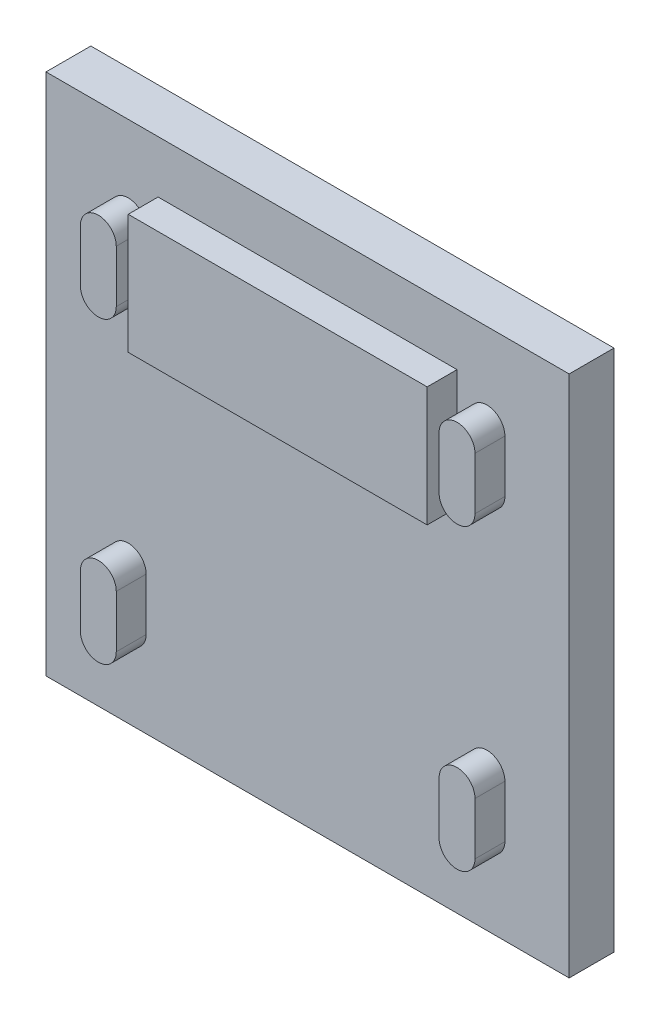
ISO-10303-21;
HEADER;
FILE_DESCRIPTION(('STEP AP214'),'2;1');
FILE_NAME('part.step','',(''),(''),'','','');
FILE_SCHEMA(('AUTOMOTIVE_DESIGN { 1 0 10303 214 1 1 1 1 }'));
ENDSEC;
DATA;
#1=APPLICATION_CONTEXT('core data for automotive mechanical design processes');
#2=APPLICATION_PROTOCOL_DEFINITION('international standard','automotive_design',2000,#1);
#3=PRODUCT_CONTEXT('',#1,'mechanical');
#4=PRODUCT('Part','Part','',(#3));
#5=PRODUCT_RELATED_PRODUCT_CATEGORY('part','',(#4));
#6=PRODUCT_DEFINITION_FORMATION('','',#4);
#7=PRODUCT_DEFINITION_CONTEXT('part definition',#1,'design');
#8=PRODUCT_DEFINITION('design','',#6,#7);
#9=PRODUCT_DEFINITION_SHAPE('','',#8);
#10=(LENGTH_UNIT() NAMED_UNIT(*) SI_UNIT(.MILLI.,.METRE.));
#11=(NAMED_UNIT(*) PLANE_ANGLE_UNIT() SI_UNIT($,.RADIAN.));
#12=(NAMED_UNIT(*) SI_UNIT($,.STERADIAN.) SOLID_ANGLE_UNIT());
#13=UNCERTAINTY_MEASURE_WITH_UNIT(LENGTH_MEASURE(1.E-05),#10,'distance_accuracy_value','');
#14=(GEOMETRIC_REPRESENTATION_CONTEXT(3) GLOBAL_UNCERTAINTY_ASSIGNED_CONTEXT((#13)) GLOBAL_UNIT_ASSIGNED_CONTEXT((#10,
#11,#12)) REPRESENTATION_CONTEXT('',''));
#15=CARTESIAN_POINT('',(0.,0.,0.));
#16=DIRECTION('',(0.,0.,1.));
#17=DIRECTION('',(1.,0.,0.));
#18=AXIS2_PLACEMENT_3D('',#15,#16,#17);
#19=CARTESIAN_POINT('',(0.,0.,3.));
#20=DIRECTION('',(0.,0.,1.));
#21=DIRECTION('',(1.,0.,0.));
#22=AXIS2_PLACEMENT_3D('',#19,#20,#21);
#23=PLANE('',#22);
#24=DIRECTION('',(0.,-1.,0.));
#25=VECTOR('',#24,1.);
#26=CARTESIAN_POINT('',(-17.5,-17.5,3.));
#27=LINE('',#26,#25);
#28=CARTESIAN_POINT('',(-17.5,17.5,3.));
#29=VERTEX_POINT('',#28);
#30=CARTESIAN_POINT('',(-17.5,-17.5,3.));
#31=VERTEX_POINT('',#30);
#32=EDGE_CURVE('E358',#29,#31,#27,.T.);
#33=ORIENTED_EDGE('',*,*,#32,.T.);
#34=DIRECTION('',(1.,0.,0.));
#35=VECTOR('',#34,1.);
#36=CARTESIAN_POINT('',(17.5,-17.5,3.));
#37=LINE('',#36,#35);
#38=CARTESIAN_POINT('',(17.5,-17.5,3.));
#39=VERTEX_POINT('',#38);
#40=EDGE_CURVE('E361',#31,#39,#37,.T.);
#41=ORIENTED_EDGE('',*,*,#40,.T.);
#42=DIRECTION('',(0.,1.,0.));
#43=VECTOR('',#42,1.);
#44=CARTESIAN_POINT('',(17.5,-17.5,3.));
#45=LINE('',#44,#43);
#46=CARTESIAN_POINT('',(17.5,17.5,3.));
#47=VERTEX_POINT('',#46);
#48=EDGE_CURVE('E364',#39,#47,#45,.T.);
#49=ORIENTED_EDGE('',*,*,#48,.T.);
#50=DIRECTION('',(-1.,0.,0.));
#51=VECTOR('',#50,1.);
#52=CARTESIAN_POINT('',(17.5,17.5,3.));
#53=LINE('',#52,#51);
#54=EDGE_CURVE('E366',#47,#29,#53,.T.);
#55=ORIENTED_EDGE('',*,*,#54,.T.);
#56=EDGE_LOOP('',(#33,#41,#49,#55));
#57=FACE_BOUND('',#56,.T.);
#58=DIRECTION('',(0.,1.,0.));
#59=VECTOR('',#58,1.);
#60=CARTESIAN_POINT('',(-10.8,8.25,3.));
#61=LINE('',#60,#59);
#62=CARTESIAN_POINT('',(-10.8,8.25,3.));
#63=VERTEX_POINT('',#62);
#64=CARTESIAN_POINT('',(-10.8,11.75,3.));
#65=VERTEX_POINT('',#64);
#66=EDGE_CURVE('E237',#63,#65,#61,.T.);
#67=ORIENTED_EDGE('',*,*,#66,.F.);
#68=CARTESIAN_POINT('',(-12.,8.25,3.));
#69=DIRECTION('',(0.,0.,1.));
#70=DIRECTION('',(1.,0.,0.));
#71=AXIS2_PLACEMENT_3D('',#68,#69,#70);
#72=CIRCLE('',#71,1.2);
#73=CARTESIAN_POINT('',(-13.2,8.25,3.));
#74=VERTEX_POINT('',#73);
#75=EDGE_CURVE('E234',#74,#63,#72,.T.);
#76=ORIENTED_EDGE('',*,*,#75,.F.);
#77=DIRECTION('',(0.,-1.,0.));
#78=VECTOR('',#77,1.);
#79=CARTESIAN_POINT('',(-13.2,8.25,3.));
#80=LINE('',#79,#78);
#81=CARTESIAN_POINT('',(-13.2,11.75,3.));
#82=VERTEX_POINT('',#81);
#83=EDGE_CURVE('E336',#82,#74,#80,.T.);
#84=ORIENTED_EDGE('',*,*,#83,.F.);
#85=CARTESIAN_POINT('',(-12.,11.75,3.));
#86=DIRECTION('',(0.,0.,1.));
#87=DIRECTION('',(1.,0.,0.));
#88=AXIS2_PLACEMENT_3D('',#85,#86,#87);
#89=CIRCLE('',#88,1.2);
#90=EDGE_CURVE('E344',#65,#82,#89,.T.);
#91=ORIENTED_EDGE('',*,*,#90,.F.);
#92=EDGE_LOOP('',(#67,#76,#84,#91));
#93=FACE_BOUND('',#92,.T.);
#94=DIRECTION('',(0.,1.,0.));
#95=VECTOR('',#94,1.);
#96=CARTESIAN_POINT('',(-10.8,-11.75,3.));
#97=LINE('',#96,#95);
#98=CARTESIAN_POINT('',(-10.8,-11.75,3.));
#99=VERTEX_POINT('',#98);
#100=CARTESIAN_POINT('',(-10.8,-8.25,3.));
#101=VERTEX_POINT('',#100);
#102=EDGE_CURVE('E233',#99,#101,#97,.T.);
#103=ORIENTED_EDGE('',*,*,#102,.F.);
#104=CARTESIAN_POINT('',(-12.,-11.75,3.));
#105=DIRECTION('',(0.,0.,1.));
#106=DIRECTION('',(1.,0.,0.));
#107=AXIS2_PLACEMENT_3D('',#104,#105,#106);
#108=CIRCLE('',#107,1.2);
#109=CARTESIAN_POINT('',(-13.2,-11.75,3.));
#110=VERTEX_POINT('',#109);
#111=EDGE_CURVE('E227',#110,#99,#108,.T.);
#112=ORIENTED_EDGE('',*,*,#111,.F.);
#113=DIRECTION('',(0.,-1.,0.));
#114=VECTOR('',#113,1.);
#115=CARTESIAN_POINT('',(-13.2,-11.75,3.));
#116=LINE('',#115,#114);
#117=CARTESIAN_POINT('',(-13.2,-8.25,3.));
#118=VERTEX_POINT('',#117);
#119=EDGE_CURVE('E208',#118,#110,#116,.T.);
#120=ORIENTED_EDGE('',*,*,#119,.F.);
#121=CARTESIAN_POINT('',(-12.,-8.25,3.));
#122=DIRECTION('',(0.,0.,1.));
#123=DIRECTION('',(1.,0.,0.));
#124=AXIS2_PLACEMENT_3D('',#121,#122,#123);
#125=CIRCLE('',#124,1.2);
#126=EDGE_CURVE('E220',#101,#118,#125,.T.);
#127=ORIENTED_EDGE('',*,*,#126,.F.);
#128=EDGE_LOOP('',(#103,#112,#120,#127));
#129=FACE_BOUND('',#128,.T.);
#130=DIRECTION('',(0.,1.,0.));
#131=VECTOR('',#130,1.);
#132=CARTESIAN_POINT('',(13.2,-11.75,3.));
#133=LINE('',#132,#131);
#134=CARTESIAN_POINT('',(13.2,-11.75,3.));
#135=VERTEX_POINT('',#134);
#136=CARTESIAN_POINT('',(13.2,-8.25,3.));
#137=VERTEX_POINT('',#136);
#138=EDGE_CURVE('E266',#135,#137,#133,.T.);
#139=ORIENTED_EDGE('',*,*,#138,.F.);
#140=CARTESIAN_POINT('',(12.,-11.75,3.));
#141=DIRECTION('',(0.,0.,1.));
#142=DIRECTION('',(1.,0.,0.));
#143=AXIS2_PLACEMENT_3D('',#140,#141,#142);
#144=CIRCLE('',#143,1.2);
#145=CARTESIAN_POINT('',(10.8,-11.75,3.));
#146=VERTEX_POINT('',#145);
#147=EDGE_CURVE('E268',#146,#135,#144,.T.);
#148=ORIENTED_EDGE('',*,*,#147,.F.);
#149=DIRECTION('',(0.,-1.,0.));
#150=VECTOR('',#149,1.);
#151=CARTESIAN_POINT('',(10.8,-11.75,3.));
#152=LINE('',#151,#150);
#153=CARTESIAN_POINT('',(10.8,-8.25,3.));
#154=VERTEX_POINT('',#153);
#155=EDGE_CURVE('E260',#154,#146,#152,.T.);
#156=ORIENTED_EDGE('',*,*,#155,.F.);
#157=CARTESIAN_POINT('',(12.,-8.25,3.));
#158=DIRECTION('',(0.,0.,1.));
#159=DIRECTION('',(1.,0.,0.));
#160=AXIS2_PLACEMENT_3D('',#157,#158,#159);
#161=CIRCLE('',#160,1.2);
#162=EDGE_CURVE('E262',#137,#154,#161,.T.);
#163=ORIENTED_EDGE('',*,*,#162,.F.);
#164=EDGE_LOOP('',(#139,#148,#156,#163));
#165=FACE_BOUND('',#164,.T.);
#166=DIRECTION('',(0.,1.,0.));
#167=VECTOR('',#166,1.);
#168=CARTESIAN_POINT('',(13.2,8.25,3.));
#169=LINE('',#168,#167);
#170=CARTESIAN_POINT('',(13.2,8.25,3.));
#171=VERTEX_POINT('',#170);
#172=CARTESIAN_POINT('',(13.2,11.75,3.));
#173=VERTEX_POINT('',#172);
#174=EDGE_CURVE('E295',#171,#173,#169,.T.);
#175=ORIENTED_EDGE('',*,*,#174,.F.);
#176=CARTESIAN_POINT('',(12.,8.25,3.));
#177=DIRECTION('',(0.,0.,1.));
#178=DIRECTION('',(1.,0.,0.));
#179=AXIS2_PLACEMENT_3D('',#176,#177,#178);
#180=CIRCLE('',#179,1.2);
#181=CARTESIAN_POINT('',(10.8,8.25,3.));
#182=VERTEX_POINT('',#181);
#183=EDGE_CURVE('E251',#182,#171,#180,.T.);
#184=ORIENTED_EDGE('',*,*,#183,.F.);
#185=DIRECTION('',(0.,-1.,0.));
#186=VECTOR('',#185,1.);
#187=CARTESIAN_POINT('',(10.8,8.25,3.));
#188=LINE('',#187,#186);
#189=CARTESIAN_POINT('',(10.8,11.75,3.));
#190=VERTEX_POINT('',#189);
#191=EDGE_CURVE('E290',#190,#182,#188,.T.);
#192=ORIENTED_EDGE('',*,*,#191,.F.);
#193=CARTESIAN_POINT('',(12.,11.75,3.));
#194=DIRECTION('',(0.,0.,1.));
#195=DIRECTION('',(1.,0.,0.));
#196=AXIS2_PLACEMENT_3D('',#193,#194,#195);
#197=CIRCLE('',#196,1.2);
#198=EDGE_CURVE('E292',#173,#190,#197,.T.);
#199=ORIENTED_EDGE('',*,*,#198,.F.);
#200=EDGE_LOOP('',(#175,#184,#192,#199));
#201=FACE_BOUND('',#200,.T.);
#202=DIRECTION('',(-1.,0.,0.));
#203=VECTOR('',#202,1.);
#204=CARTESIAN_POINT('',(-10.,14.,3.));
#205=LINE('',#204,#203);
#206=CARTESIAN_POINT('',(10.,14.,3.));
#207=VERTEX_POINT('',#206);
#208=CARTESIAN_POINT('',(-10.,14.,3.));
#209=VERTEX_POINT('',#208);
#210=EDGE_CURVE('E321',#207,#209,#205,.T.);
#211=ORIENTED_EDGE('',*,*,#210,.F.);
#212=DIRECTION('',(0.,1.,0.));
#213=VECTOR('',#212,1.);
#214=CARTESIAN_POINT('',(10.,6.,3.));
#215=LINE('',#214,#213);
#216=CARTESIAN_POINT('',(10.,6.,3.));
#217=VERTEX_POINT('',#216);
#218=EDGE_CURVE('E282',#217,#207,#215,.T.);
#219=ORIENTED_EDGE('',*,*,#218,.F.);
#220=DIRECTION('',(1.,0.,0.));
#221=VECTOR('',#220,1.);
#222=CARTESIAN_POINT('',(-10.,6.,3.));
#223=LINE('',#222,#221);
#224=CARTESIAN_POINT('',(-10.,6.,3.));
#225=VERTEX_POINT('',#224);
#226=EDGE_CURVE('E316',#225,#217,#223,.T.);
#227=ORIENTED_EDGE('',*,*,#226,.F.);
#228=DIRECTION('',(0.,-1.,0.));
#229=VECTOR('',#228,1.);
#230=CARTESIAN_POINT('',(-10.,6.,3.));
#231=LINE('',#230,#229);
#232=EDGE_CURVE('E318',#209,#225,#231,.T.);
#233=ORIENTED_EDGE('',*,*,#232,.F.);
#234=EDGE_LOOP('',(#211,#219,#227,#233));
#235=FACE_BOUND('',#234,.T.);
#236=ADVANCED_FACE('F45',(#57,#93,#129,#165,#201,#235),#23,.T.);
#237=CARTESIAN_POINT('',(-17.5,-17.5,3.));
#238=DIRECTION('',(1.,0.,0.));
#239=DIRECTION('',(0.,0.,-1.));
#240=AXIS2_PLACEMENT_3D('',#237,#238,#239);
#241=PLANE('',#240);
#242=DIRECTION('',(0.,-1.,0.));
#243=VECTOR('',#242,1.);
#244=CARTESIAN_POINT('',(-17.5,-17.5,0.));
#245=LINE('',#244,#243);
#246=CARTESIAN_POINT('',(-17.5,17.5,0.));
#247=VERTEX_POINT('',#246);
#248=CARTESIAN_POINT('',(-17.5,-17.5,0.));
#249=VERTEX_POINT('',#248);
#250=EDGE_CURVE('E357',#247,#249,#245,.T.);
#251=ORIENTED_EDGE('',*,*,#250,.T.);
#252=DIRECTION('',(0.,0.,-1.));
#253=VECTOR('',#252,1.);
#254=CARTESIAN_POINT('',(-17.5,-17.5,3.));
#255=LINE('',#254,#253);
#256=EDGE_CURVE('E11',#31,#249,#255,.T.);
#257=ORIENTED_EDGE('',*,*,#256,.F.);
#258=ORIENTED_EDGE('',*,*,#32,.F.);
#259=DIRECTION('',(0.,0.,-1.));
#260=VECTOR('',#259,1.);
#261=CARTESIAN_POINT('',(-17.5,17.5,3.));
#262=LINE('',#261,#260);
#263=EDGE_CURVE('E368',#29,#247,#262,.T.);
#264=ORIENTED_EDGE('',*,*,#263,.T.);
#265=EDGE_LOOP('',(#251,#257,#258,#264));
#266=FACE_BOUND('',#265,.T.);
#267=ADVANCED_FACE('F47',(#266),#241,.F.);
#268=CARTESIAN_POINT('',(17.5,-17.5,3.));
#269=DIRECTION('',(0.,1.,0.));
#270=DIRECTION('',(-1.,0.,0.));
#271=AXIS2_PLACEMENT_3D('',#268,#269,#270);
#272=PLANE('',#271);
#273=DIRECTION('',(1.,0.,0.));
#274=VECTOR('',#273,1.);
#275=CARTESIAN_POINT('',(17.5,-17.5,0.));
#276=LINE('',#275,#274);
#277=CARTESIAN_POINT('',(17.5,-17.5,0.));
#278=VERTEX_POINT('',#277);
#279=EDGE_CURVE('E371',#249,#278,#276,.T.);
#280=ORIENTED_EDGE('',*,*,#279,.T.);
#281=DIRECTION('',(0.,0.,-1.));
#282=VECTOR('',#281,1.);
#283=CARTESIAN_POINT('',(17.5,-17.5,3.));
#284=LINE('',#283,#282);
#285=EDGE_CURVE('E53',#39,#278,#284,.T.);
#286=ORIENTED_EDGE('',*,*,#285,.F.);
#287=ORIENTED_EDGE('',*,*,#40,.F.);
#288=ORIENTED_EDGE('',*,*,#256,.T.);
#289=EDGE_LOOP('',(#280,#286,#287,#288));
#290=FACE_BOUND('',#289,.T.);
#291=ADVANCED_FACE('F401',(#290),#272,.F.);
#292=CARTESIAN_POINT('',(17.5,-17.5,3.));
#293=DIRECTION('',(-1.,0.,0.));
#294=DIRECTION('',(0.,0.,1.));
#295=AXIS2_PLACEMENT_3D('',#292,#293,#294);
#296=PLANE('',#295);
#297=DIRECTION('',(0.,1.,0.));
#298=VECTOR('',#297,1.);
#299=CARTESIAN_POINT('',(17.5,-17.5,0.));
#300=LINE('',#299,#298);
#301=CARTESIAN_POINT('',(17.5,17.5,0.));
#302=VERTEX_POINT('',#301);
#303=EDGE_CURVE('E373',#278,#302,#300,.T.);
#304=ORIENTED_EDGE('',*,*,#303,.T.);
#305=DIRECTION('',(0.,0.,-1.));
#306=VECTOR('',#305,1.);
#307=CARTESIAN_POINT('',(17.5,17.5,3.));
#308=LINE('',#307,#306);
#309=EDGE_CURVE('E378',#47,#302,#308,.T.);
#310=ORIENTED_EDGE('',*,*,#309,.F.);
#311=ORIENTED_EDGE('',*,*,#48,.F.);
#312=ORIENTED_EDGE('',*,*,#285,.T.);
#313=EDGE_LOOP('',(#304,#310,#311,#312));
#314=FACE_BOUND('',#313,.T.);
#315=ADVANCED_FACE('F385',(#314),#296,.F.);
#316=CARTESIAN_POINT('',(17.5,17.5,3.));
#317=DIRECTION('',(0.,-1.,0.));
#318=DIRECTION('',(1.,0.,0.));
#319=AXIS2_PLACEMENT_3D('',#316,#317,#318);
#320=PLANE('',#319);
#321=DIRECTION('',(-1.,0.,0.));
#322=VECTOR('',#321,1.);
#323=CARTESIAN_POINT('',(17.5,17.5,0.));
#324=LINE('',#323,#322);
#325=EDGE_CURVE('E362',#302,#247,#324,.T.);
#326=ORIENTED_EDGE('',*,*,#325,.T.);
#327=ORIENTED_EDGE('',*,*,#263,.F.);
#328=ORIENTED_EDGE('',*,*,#54,.F.);
#329=ORIENTED_EDGE('',*,*,#309,.T.);
#330=EDGE_LOOP('',(#326,#327,#328,#329));
#331=FACE_BOUND('',#330,.T.);
#332=ADVANCED_FACE('F394',(#331),#320,.F.);
#333=CARTESIAN_POINT('',(0.,0.,0.));
#334=DIRECTION('',(0.,0.,1.));
#335=DIRECTION('',(1.,0.,0.));
#336=AXIS2_PLACEMENT_3D('',#333,#334,#335);
#337=PLANE('',#336);
#338=ORIENTED_EDGE('',*,*,#250,.F.);
#339=ORIENTED_EDGE('',*,*,#325,.F.);
#340=ORIENTED_EDGE('',*,*,#303,.F.);
#341=ORIENTED_EDGE('',*,*,#279,.F.);
#342=EDGE_LOOP('',(#338,#339,#340,#341));
#343=FACE_BOUND('',#342,.T.);
#344=ADVANCED_FACE('F391',(#343),#337,.F.);
#345=CARTESIAN_POINT('',(-12.,8.25,5.));
#346=DIRECTION('',(0.,0.,-1.));
#347=DIRECTION('',(-1.,0.,0.));
#348=AXIS2_PLACEMENT_3D('',#345,#346,#347);
#349=CYLINDRICAL_SURFACE('',#348,1.2);
#350=ORIENTED_EDGE('',*,*,#75,.T.);
#351=DIRECTION('',(0.,0.,-1.));
#352=VECTOR('',#351,1.);
#353=CARTESIAN_POINT('',(-10.8,8.25,5.));
#354=LINE('',#353,#352);
#355=CARTESIAN_POINT('',(-10.8,8.25,5.));
#356=VERTEX_POINT('',#355);
#357=EDGE_CURVE('E355',#356,#63,#354,.T.);
#358=ORIENTED_EDGE('',*,*,#357,.F.);
#359=CARTESIAN_POINT('',(-12.,8.25,5.));
#360=DIRECTION('',(0.,0.,1.));
#361=DIRECTION('',(1.,0.,0.));
#362=AXIS2_PLACEMENT_3D('',#359,#360,#361);
#363=CIRCLE('',#362,1.2);
#364=CARTESIAN_POINT('',(-13.2,8.25,5.));
#365=VERTEX_POINT('',#364);
#366=EDGE_CURVE('E332',#365,#356,#363,.T.);
#367=ORIENTED_EDGE('',*,*,#366,.F.);
#368=DIRECTION('',(0.,0.,-1.));
#369=VECTOR('',#368,1.);
#370=CARTESIAN_POINT('',(-13.2,8.25,5.));
#371=LINE('',#370,#369);
#372=EDGE_CURVE('E341',#365,#74,#371,.T.);
#373=ORIENTED_EDGE('',*,*,#372,.T.);
#374=EDGE_LOOP('',(#350,#358,#367,#373));
#375=FACE_BOUND('',#374,.T.);
#376=ADVANCED_FACE('F414',(#375),#349,.T.);
#377=CARTESIAN_POINT('',(-10.8,8.25,5.));
#378=DIRECTION('',(-1.,0.,0.));
#379=DIRECTION('',(0.,0.,1.));
#380=AXIS2_PLACEMENT_3D('',#377,#378,#379);
#381=PLANE('',#380);
#382=ORIENTED_EDGE('',*,*,#66,.T.);
#383=DIRECTION('',(0.,0.,-1.));
#384=VECTOR('',#383,1.);
#385=CARTESIAN_POINT('',(-10.8,11.75,5.));
#386=LINE('',#385,#384);
#387=CARTESIAN_POINT('',(-10.8,11.75,5.));
#388=VERTEX_POINT('',#387);
#389=EDGE_CURVE('E352',#388,#65,#386,.T.);
#390=ORIENTED_EDGE('',*,*,#389,.F.);
#391=DIRECTION('',(0.,1.,0.));
#392=VECTOR('',#391,1.);
#393=CARTESIAN_POINT('',(-10.8,8.25,5.));
#394=LINE('',#393,#392);
#395=EDGE_CURVE('E335',#356,#388,#394,.T.);
#396=ORIENTED_EDGE('',*,*,#395,.F.);
#397=ORIENTED_EDGE('',*,*,#357,.T.);
#398=EDGE_LOOP('',(#382,#390,#396,#397));
#399=FACE_BOUND('',#398,.T.);
#400=ADVANCED_FACE('F449',(#399),#381,.F.);
#401=CARTESIAN_POINT('',(-12.,11.75,5.));
#402=DIRECTION('',(0.,0.,-1.));
#403=DIRECTION('',(-1.,0.,0.));
#404=AXIS2_PLACEMENT_3D('',#401,#402,#403);
#405=CYLINDRICAL_SURFACE('',#404,1.2);
#406=ORIENTED_EDGE('',*,*,#90,.T.);
#407=DIRECTION('',(0.,0.,-1.));
#408=VECTOR('',#407,1.);
#409=CARTESIAN_POINT('',(-13.2,11.75,5.));
#410=LINE('',#409,#408);
#411=CARTESIAN_POINT('',(-13.2,11.75,5.));
#412=VERTEX_POINT('',#411);
#413=EDGE_CURVE('E350',#412,#82,#410,.T.);
#414=ORIENTED_EDGE('',*,*,#413,.F.);
#415=CARTESIAN_POINT('',(-12.,11.75,5.));
#416=DIRECTION('',(0.,0.,1.));
#417=DIRECTION('',(1.,0.,0.));
#418=AXIS2_PLACEMENT_3D('',#415,#416,#417);
#419=CIRCLE('',#418,1.2);
#420=EDGE_CURVE('E338',#388,#412,#419,.T.);
#421=ORIENTED_EDGE('',*,*,#420,.F.);
#422=ORIENTED_EDGE('',*,*,#389,.T.);
#423=EDGE_LOOP('',(#406,#414,#421,#422));
#424=FACE_BOUND('',#423,.T.);
#425=ADVANCED_FACE('F456',(#424),#405,.T.);
#426=CARTESIAN_POINT('',(-13.2,8.25,5.));
#427=DIRECTION('',(1.,0.,0.));
#428=DIRECTION('',(0.,0.,-1.));
#429=AXIS2_PLACEMENT_3D('',#426,#427,#428);
#430=PLANE('',#429);
#431=ORIENTED_EDGE('',*,*,#83,.T.);
#432=ORIENTED_EDGE('',*,*,#372,.F.);
#433=DIRECTION('',(0.,-1.,0.));
#434=VECTOR('',#433,1.);
#435=CARTESIAN_POINT('',(-13.2,8.25,5.));
#436=LINE('',#435,#434);
#437=EDGE_CURVE('E340',#412,#365,#436,.T.);
#438=ORIENTED_EDGE('',*,*,#437,.F.);
#439=ORIENTED_EDGE('',*,*,#413,.T.);
#440=EDGE_LOOP('',(#431,#432,#438,#439));
#441=FACE_BOUND('',#440,.T.);
#442=ADVANCED_FACE('F464',(#441),#430,.F.);
#443=CARTESIAN_POINT('',(-12.,8.25,5.));
#444=DIRECTION('',(0.,0.,1.));
#445=DIRECTION('',(1.,0.,0.));
#446=AXIS2_PLACEMENT_3D('',#443,#444,#445);
#447=PLANE('',#446);
#448=ORIENTED_EDGE('',*,*,#366,.T.);
#449=ORIENTED_EDGE('',*,*,#395,.T.);
#450=ORIENTED_EDGE('',*,*,#420,.T.);
#451=ORIENTED_EDGE('',*,*,#437,.T.);
#452=EDGE_LOOP('',(#448,#449,#450,#451));
#453=FACE_BOUND('',#452,.T.);
#454=ADVANCED_FACE('F473',(#453),#447,.T.);
#455=CARTESIAN_POINT('',(-12.,-11.75,5.));
#456=DIRECTION('',(0.,0.,-1.));
#457=DIRECTION('',(-1.,0.,0.));
#458=AXIS2_PLACEMENT_3D('',#455,#456,#457);
#459=CYLINDRICAL_SURFACE('',#458,1.2);
#460=ORIENTED_EDGE('',*,*,#111,.T.);
#461=DIRECTION('',(0.,0.,-1.));
#462=VECTOR('',#461,1.);
#463=CARTESIAN_POINT('',(-10.8,-11.75,5.));
#464=LINE('',#463,#462);
#465=CARTESIAN_POINT('',(-10.8,-11.75,5.));
#466=VERTEX_POINT('',#465);
#467=EDGE_CURVE('E271',#466,#99,#464,.T.);
#468=ORIENTED_EDGE('',*,*,#467,.F.);
#469=CARTESIAN_POINT('',(-12.,-11.75,5.));
#470=DIRECTION('',(0.,0.,1.));
#471=DIRECTION('',(1.,0.,0.));
#472=AXIS2_PLACEMENT_3D('',#469,#470,#471);
#473=CIRCLE('',#472,1.2);
#474=CARTESIAN_POINT('',(-13.2,-11.75,5.));
#475=VERTEX_POINT('',#474);
#476=EDGE_CURVE('E221',#475,#466,#473,.T.);
#477=ORIENTED_EDGE('',*,*,#476,.F.);
#478=DIRECTION('',(0.,0.,-1.));
#479=VECTOR('',#478,1.);
#480=CARTESIAN_POINT('',(-13.2,-11.75,5.));
#481=LINE('',#480,#479);
#482=EDGE_CURVE('E212',#475,#110,#481,.T.);
#483=ORIENTED_EDGE('',*,*,#482,.T.);
#484=EDGE_LOOP('',(#460,#468,#477,#483));
#485=FACE_BOUND('',#484,.T.);
#486=ADVANCED_FACE('F225',(#485),#459,.T.);
#487=CARTESIAN_POINT('',(-10.8,-11.75,5.));
#488=DIRECTION('',(-1.,0.,0.));
#489=DIRECTION('',(0.,0.,1.));
#490=AXIS2_PLACEMENT_3D('',#487,#488,#489);
#491=PLANE('',#490);
#492=ORIENTED_EDGE('',*,*,#102,.T.);
#493=DIRECTION('',(0.,0.,-1.));
#494=VECTOR('',#493,1.);
#495=CARTESIAN_POINT('',(-10.8,-8.25,5.));
#496=LINE('',#495,#494);
#497=CARTESIAN_POINT('',(-10.8,-8.25,5.));
#498=VERTEX_POINT('',#497);
#499=EDGE_CURVE('E717',#498,#101,#496,.T.);
#500=ORIENTED_EDGE('',*,*,#499,.F.);
#501=DIRECTION('',(0.,1.,0.));
#502=VECTOR('',#501,1.);
#503=CARTESIAN_POINT('',(-10.8,-11.75,5.));
#504=LINE('',#503,#502);
#505=EDGE_CURVE('E245',#466,#498,#504,.T.);
#506=ORIENTED_EDGE('',*,*,#505,.F.);
#507=ORIENTED_EDGE('',*,*,#467,.T.);
#508=EDGE_LOOP('',(#492,#500,#506,#507));
#509=FACE_BOUND('',#508,.T.);
#510=ADVANCED_FACE('F490',(#509),#491,.F.);
#511=CARTESIAN_POINT('',(-12.,-8.25,5.));
#512=DIRECTION('',(0.,0.,-1.));
#513=DIRECTION('',(-1.,0.,0.));
#514=AXIS2_PLACEMENT_3D('',#511,#512,#513);
#515=CYLINDRICAL_SURFACE('',#514,1.2);
#516=ORIENTED_EDGE('',*,*,#126,.T.);
#517=DIRECTION('',(0.,0.,-1.));
#518=VECTOR('',#517,1.);
#519=CARTESIAN_POINT('',(-13.2,-8.25,5.));
#520=LINE('',#519,#518);
#521=CARTESIAN_POINT('',(-13.2,-8.25,5.));
#522=VERTEX_POINT('',#521);
#523=EDGE_CURVE('E215',#522,#118,#520,.T.);
#524=ORIENTED_EDGE('',*,*,#523,.F.);
#525=CARTESIAN_POINT('',(-12.,-8.25,5.));
#526=DIRECTION('',(0.,0.,1.));
#527=DIRECTION('',(1.,0.,0.));
#528=AXIS2_PLACEMENT_3D('',#525,#526,#527);
#529=CIRCLE('',#528,1.2);
#530=EDGE_CURVE('E243',#498,#522,#529,.T.);
#531=ORIENTED_EDGE('',*,*,#530,.F.);
#532=ORIENTED_EDGE('',*,*,#499,.T.);
#533=EDGE_LOOP('',(#516,#524,#531,#532));
#534=FACE_BOUND('',#533,.T.);
#535=ADVANCED_FACE('F498',(#534),#515,.T.);
#536=CARTESIAN_POINT('',(-13.2,-11.75,5.));
#537=DIRECTION('',(1.,0.,0.));
#538=DIRECTION('',(0.,0.,-1.));
#539=AXIS2_PLACEMENT_3D('',#536,#537,#538);
#540=PLANE('',#539);
#541=ORIENTED_EDGE('',*,*,#119,.T.);
#542=ORIENTED_EDGE('',*,*,#482,.F.);
#543=DIRECTION('',(0.,-1.,0.));
#544=VECTOR('',#543,1.);
#545=CARTESIAN_POINT('',(-13.2,-11.75,5.));
#546=LINE('',#545,#544);
#547=EDGE_CURVE('E230',#522,#475,#546,.T.);
#548=ORIENTED_EDGE('',*,*,#547,.F.);
#549=ORIENTED_EDGE('',*,*,#523,.T.);
#550=EDGE_LOOP('',(#541,#542,#548,#549));
#551=FACE_BOUND('',#550,.T.);
#552=ADVANCED_FACE('F210',(#551),#540,.F.);
#553=CARTESIAN_POINT('',(-12.,-11.75,5.));
#554=DIRECTION('',(0.,0.,1.));
#555=DIRECTION('',(1.,0.,0.));
#556=AXIS2_PLACEMENT_3D('',#553,#554,#555);
#557=PLANE('',#556);
#558=ORIENTED_EDGE('',*,*,#476,.T.);
#559=ORIENTED_EDGE('',*,*,#505,.T.);
#560=ORIENTED_EDGE('',*,*,#530,.T.);
#561=ORIENTED_EDGE('',*,*,#547,.T.);
#562=EDGE_LOOP('',(#558,#559,#560,#561));
#563=FACE_BOUND('',#562,.T.);
#564=ADVANCED_FACE('F515',(#563),#557,.T.);
#565=CARTESIAN_POINT('',(12.,-11.75,5.));
#566=DIRECTION('',(0.,0.,-1.));
#567=DIRECTION('',(-1.,0.,0.));
#568=AXIS2_PLACEMENT_3D('',#565,#566,#567);
#569=CYLINDRICAL_SURFACE('',#568,1.2);
#570=ORIENTED_EDGE('',*,*,#147,.T.);
#571=DIRECTION('',(0.,0.,-1.));
#572=VECTOR('',#571,1.);
#573=CARTESIAN_POINT('',(13.2,-11.75,5.));
#574=LINE('',#573,#572);
#575=CARTESIAN_POINT('',(13.2,-11.75,5.));
#576=VERTEX_POINT('',#575);
#577=EDGE_CURVE('E248',#576,#135,#574,.T.);
#578=ORIENTED_EDGE('',*,*,#577,.F.);
#579=CARTESIAN_POINT('',(12.,-11.75,5.));
#580=DIRECTION('',(0.,0.,1.));
#581=DIRECTION('',(1.,0.,0.));
#582=AXIS2_PLACEMENT_3D('',#579,#580,#581);
#583=CIRCLE('',#582,1.2);
#584=CARTESIAN_POINT('',(10.8,-11.75,5.));
#585=VERTEX_POINT('',#584);
#586=EDGE_CURVE('E263',#585,#576,#583,.T.);
#587=ORIENTED_EDGE('',*,*,#586,.F.);
#588=DIRECTION('',(0.,0.,-1.));
#589=VECTOR('',#588,1.);
#590=CARTESIAN_POINT('',(10.8,-11.75,5.));
#591=LINE('',#590,#589);
#592=EDGE_CURVE('E256',#585,#146,#591,.T.);
#593=ORIENTED_EDGE('',*,*,#592,.T.);
#594=EDGE_LOOP('',(#570,#578,#587,#593));
#595=FACE_BOUND('',#594,.T.);
#596=ADVANCED_FACE('F523',(#595),#569,.T.);
#597=CARTESIAN_POINT('',(13.2,-11.75,5.));
#598=DIRECTION('',(-1.,0.,0.));
#599=DIRECTION('',(0.,0.,1.));
#600=AXIS2_PLACEMENT_3D('',#597,#598,#599);
#601=PLANE('',#600);
#602=ORIENTED_EDGE('',*,*,#138,.T.);
#603=DIRECTION('',(0.,0.,-1.));
#604=VECTOR('',#603,1.);
#605=CARTESIAN_POINT('',(13.2,-8.25,5.));
#606=LINE('',#605,#604);
#607=CARTESIAN_POINT('',(13.2,-8.25,5.));
#608=VERTEX_POINT('',#607);
#609=EDGE_CURVE('E250',#608,#137,#606,.T.);
#610=ORIENTED_EDGE('',*,*,#609,.F.);
#611=DIRECTION('',(0.,1.,0.));
#612=VECTOR('',#611,1.);
#613=CARTESIAN_POINT('',(13.2,-11.75,5.));
#614=LINE('',#613,#612);
#615=EDGE_CURVE('E275',#576,#608,#614,.T.);
#616=ORIENTED_EDGE('',*,*,#615,.F.);
#617=ORIENTED_EDGE('',*,*,#577,.T.);
#618=EDGE_LOOP('',(#602,#610,#616,#617));
#619=FACE_BOUND('',#618,.T.);
#620=ADVANCED_FACE('F532',(#619),#601,.F.);
#621=CARTESIAN_POINT('',(12.,-8.25,5.));
#622=DIRECTION('',(0.,0.,-1.));
#623=DIRECTION('',(-1.,0.,0.));
#624=AXIS2_PLACEMENT_3D('',#621,#622,#623);
#625=CYLINDRICAL_SURFACE('',#624,1.2);
#626=ORIENTED_EDGE('',*,*,#162,.T.);
#627=DIRECTION('',(0.,0.,-1.));
#628=VECTOR('',#627,1.);
#629=CARTESIAN_POINT('',(10.8,-8.25,5.));
#630=LINE('',#629,#628);
#631=CARTESIAN_POINT('',(10.8,-8.25,5.));
#632=VERTEX_POINT('',#631);
#633=EDGE_CURVE('E254',#632,#154,#630,.T.);
#634=ORIENTED_EDGE('',*,*,#633,.F.);
#635=CARTESIAN_POINT('',(12.,-8.25,5.));
#636=DIRECTION('',(0.,0.,1.));
#637=DIRECTION('',(1.,0.,0.));
#638=AXIS2_PLACEMENT_3D('',#635,#636,#637);
#639=CIRCLE('',#638,1.2);
#640=EDGE_CURVE('E273',#608,#632,#639,.T.);
#641=ORIENTED_EDGE('',*,*,#640,.F.);
#642=ORIENTED_EDGE('',*,*,#609,.T.);
#643=EDGE_LOOP('',(#626,#634,#641,#642));
#644=FACE_BOUND('',#643,.T.);
#645=ADVANCED_FACE('F541',(#644),#625,.T.);
#646=CARTESIAN_POINT('',(10.8,-11.75,5.));
#647=DIRECTION('',(1.,0.,0.));
#648=DIRECTION('',(0.,0.,-1.));
#649=AXIS2_PLACEMENT_3D('',#646,#647,#648);
#650=PLANE('',#649);
#651=ORIENTED_EDGE('',*,*,#155,.T.);
#652=ORIENTED_EDGE('',*,*,#592,.F.);
#653=DIRECTION('',(0.,-1.,0.));
#654=VECTOR('',#653,1.);
#655=CARTESIAN_POINT('',(10.8,-11.75,5.));
#656=LINE('',#655,#654);
#657=EDGE_CURVE('E259',#632,#585,#656,.T.);
#658=ORIENTED_EDGE('',*,*,#657,.F.);
#659=ORIENTED_EDGE('',*,*,#633,.T.);
#660=EDGE_LOOP('',(#651,#652,#658,#659));
#661=FACE_BOUND('',#660,.T.);
#662=ADVANCED_FACE('F550',(#661),#650,.F.);
#663=CARTESIAN_POINT('',(12.,-11.75,5.));
#664=DIRECTION('',(0.,0.,1.));
#665=DIRECTION('',(1.,0.,0.));
#666=AXIS2_PLACEMENT_3D('',#663,#664,#665);
#667=PLANE('',#666);
#668=ORIENTED_EDGE('',*,*,#586,.T.);
#669=ORIENTED_EDGE('',*,*,#615,.T.);
#670=ORIENTED_EDGE('',*,*,#640,.T.);
#671=ORIENTED_EDGE('',*,*,#657,.T.);
#672=EDGE_LOOP('',(#668,#669,#670,#671));
#673=FACE_BOUND('',#672,.T.);
#674=ADVANCED_FACE('F559',(#673),#667,.T.);
#675=CARTESIAN_POINT('',(12.,8.25,5.));
#676=DIRECTION('',(0.,0.,-1.));
#677=DIRECTION('',(-1.,0.,0.));
#678=AXIS2_PLACEMENT_3D('',#675,#676,#677);
#679=CYLINDRICAL_SURFACE('',#678,1.2);
#680=ORIENTED_EDGE('',*,*,#183,.T.);
#681=DIRECTION('',(0.,0.,-1.));
#682=VECTOR('',#681,1.);
#683=CARTESIAN_POINT('',(13.2,8.25,5.));
#684=LINE('',#683,#682);
#685=CARTESIAN_POINT('',(13.2,8.25,5.));
#686=VERTEX_POINT('',#685);
#687=EDGE_CURVE('E279',#686,#171,#684,.T.);
#688=ORIENTED_EDGE('',*,*,#687,.F.);
#689=CARTESIAN_POINT('',(12.,8.25,5.));
#690=DIRECTION('',(0.,0.,1.));
#691=DIRECTION('',(1.,0.,0.));
#692=AXIS2_PLACEMENT_3D('',#689,#690,#691);
#693=CIRCLE('',#692,1.2);
#694=CARTESIAN_POINT('',(10.8,8.25,5.));
#695=VERTEX_POINT('',#694);
#696=EDGE_CURVE('E293',#695,#686,#693,.T.);
#697=ORIENTED_EDGE('',*,*,#696,.F.);
#698=DIRECTION('',(0.,0.,-1.));
#699=VECTOR('',#698,1.);
#700=CARTESIAN_POINT('',(10.8,8.25,5.));
#701=LINE('',#700,#699);
#702=EDGE_CURVE('E286',#695,#182,#701,.T.);
#703=ORIENTED_EDGE('',*,*,#702,.T.);
#704=EDGE_LOOP('',(#680,#688,#697,#703));
#705=FACE_BOUND('',#704,.T.);
#706=ADVANCED_FACE('F568',(#705),#679,.T.);
#707=CARTESIAN_POINT('',(13.2,8.25,5.));
#708=DIRECTION('',(-1.,0.,0.));
#709=DIRECTION('',(0.,0.,1.));
#710=AXIS2_PLACEMENT_3D('',#707,#708,#709);
#711=PLANE('',#710);
#712=ORIENTED_EDGE('',*,*,#174,.T.);
#713=DIRECTION('',(0.,0.,-1.));
#714=VECTOR('',#713,1.);
#715=CARTESIAN_POINT('',(13.2,11.75,5.));
#716=LINE('',#715,#714);
#717=CARTESIAN_POINT('',(13.2,11.75,5.));
#718=VERTEX_POINT('',#717);
#719=EDGE_CURVE('E281',#718,#173,#716,.T.);
#720=ORIENTED_EDGE('',*,*,#719,.F.);
#721=DIRECTION('',(0.,1.,0.));
#722=VECTOR('',#721,1.);
#723=CARTESIAN_POINT('',(13.2,8.25,5.));
#724=LINE('',#723,#722);
#725=EDGE_CURVE('E302',#686,#718,#724,.T.);
#726=ORIENTED_EDGE('',*,*,#725,.F.);
#727=ORIENTED_EDGE('',*,*,#687,.T.);
#728=EDGE_LOOP('',(#712,#720,#726,#727));
#729=FACE_BOUND('',#728,.T.);
#730=ADVANCED_FACE('F577',(#729),#711,.F.);
#731=CARTESIAN_POINT('',(12.,11.75,5.));
#732=DIRECTION('',(0.,0.,-1.));
#733=DIRECTION('',(-1.,0.,0.));
#734=AXIS2_PLACEMENT_3D('',#731,#732,#733);
#735=CYLINDRICAL_SURFACE('',#734,1.2);
#736=ORIENTED_EDGE('',*,*,#198,.T.);
#737=DIRECTION('',(0.,0.,-1.));
#738=VECTOR('',#737,1.);
#739=CARTESIAN_POINT('',(10.8,11.75,5.));
#740=LINE('',#739,#738);
#741=CARTESIAN_POINT('',(10.8,11.75,5.));
#742=VERTEX_POINT('',#741);
#743=EDGE_CURVE('E68',#742,#190,#740,.T.);
#744=ORIENTED_EDGE('',*,*,#743,.F.);
#745=CARTESIAN_POINT('',(12.,11.75,5.));
#746=DIRECTION('',(0.,0.,1.));
#747=DIRECTION('',(1.,0.,0.));
#748=AXIS2_PLACEMENT_3D('',#745,#746,#747);
#749=CIRCLE('',#748,1.2);
#750=EDGE_CURVE('E300',#718,#742,#749,.T.);
#751=ORIENTED_EDGE('',*,*,#750,.F.);
#752=ORIENTED_EDGE('',*,*,#719,.T.);
#753=EDGE_LOOP('',(#736,#744,#751,#752));
#754=FACE_BOUND('',#753,.T.);
#755=ADVANCED_FACE('F586',(#754),#735,.T.);
#756=CARTESIAN_POINT('',(10.8,8.25,5.));
#757=DIRECTION('',(1.,0.,0.));
#758=DIRECTION('',(0.,0.,-1.));
#759=AXIS2_PLACEMENT_3D('',#756,#757,#758);
#760=PLANE('',#759);
#761=ORIENTED_EDGE('',*,*,#191,.T.);
#762=ORIENTED_EDGE('',*,*,#702,.F.);
#763=DIRECTION('',(0.,-1.,0.));
#764=VECTOR('',#763,1.);
#765=CARTESIAN_POINT('',(10.8,8.25,5.));
#766=LINE('',#765,#764);
#767=EDGE_CURVE('E289',#742,#695,#766,.T.);
#768=ORIENTED_EDGE('',*,*,#767,.F.);
#769=ORIENTED_EDGE('',*,*,#743,.T.);
#770=EDGE_LOOP('',(#761,#762,#768,#769));
#771=FACE_BOUND('',#770,.T.);
#772=ADVANCED_FACE('F595',(#771),#760,.F.);
#773=CARTESIAN_POINT('',(12.,8.25,5.));
#774=DIRECTION('',(0.,0.,1.));
#775=DIRECTION('',(1.,0.,0.));
#776=AXIS2_PLACEMENT_3D('',#773,#774,#775);
#777=PLANE('',#776);
#778=ORIENTED_EDGE('',*,*,#696,.T.);
#779=ORIENTED_EDGE('',*,*,#725,.T.);
#780=ORIENTED_EDGE('',*,*,#750,.T.);
#781=ORIENTED_EDGE('',*,*,#767,.T.);
#782=EDGE_LOOP('',(#778,#779,#780,#781));
#783=FACE_BOUND('',#782,.T.);
#784=ADVANCED_FACE('F604',(#783),#777,.T.);
#785=CARTESIAN_POINT('',(10.,6.,5.));
#786=DIRECTION('',(-1.,0.,0.));
#787=DIRECTION('',(0.,0.,1.));
#788=AXIS2_PLACEMENT_3D('',#785,#786,#787);
#789=PLANE('',#788);
#790=ORIENTED_EDGE('',*,*,#218,.T.);
#791=DIRECTION('',(0.,0.,-1.));
#792=VECTOR('',#791,1.);
#793=CARTESIAN_POINT('',(10.,14.,5.));
#794=LINE('',#793,#792);
#795=CARTESIAN_POINT('',(10.,14.,5.));
#796=VERTEX_POINT('',#795);
#797=EDGE_CURVE('E306',#796,#207,#794,.T.);
#798=ORIENTED_EDGE('',*,*,#797,.F.);
#799=DIRECTION('',(0.,1.,0.));
#800=VECTOR('',#799,1.);
#801=CARTESIAN_POINT('',(10.,6.,5.));
#802=LINE('',#801,#800);
#803=CARTESIAN_POINT('',(10.,6.,5.));
#804=VERTEX_POINT('',#803);
#805=EDGE_CURVE('E319',#804,#796,#802,.T.);
#806=ORIENTED_EDGE('',*,*,#805,.F.);
#807=DIRECTION('',(0.,0.,-1.));
#808=VECTOR('',#807,1.);
#809=CARTESIAN_POINT('',(10.,6.,5.));
#810=LINE('',#809,#808);
#811=EDGE_CURVE('E312',#804,#217,#810,.T.);
#812=ORIENTED_EDGE('',*,*,#811,.T.);
#813=EDGE_LOOP('',(#790,#798,#806,#812));
#814=FACE_BOUND('',#813,.T.);
#815=ADVANCED_FACE('F612',(#814),#789,.F.);
#816=CARTESIAN_POINT('',(-10.,14.,5.));
#817=DIRECTION('',(0.,-1.,0.));
#818=DIRECTION('',(0.,0.,-1.));
#819=AXIS2_PLACEMENT_3D('',#816,#817,#818);
#820=PLANE('',#819);
#821=ORIENTED_EDGE('',*,*,#210,.T.);
#822=DIRECTION('',(0.,0.,-1.));
#823=VECTOR('',#822,1.);
#824=CARTESIAN_POINT('',(-10.,14.,5.));
#825=LINE('',#824,#823);
#826=CARTESIAN_POINT('',(-10.,14.,5.));
#827=VERTEX_POINT('',#826);
#828=EDGE_CURVE('E308',#827,#209,#825,.T.);
#829=ORIENTED_EDGE('',*,*,#828,.F.);
#830=DIRECTION('',(-1.,0.,0.));
#831=VECTOR('',#830,1.);
#832=CARTESIAN_POINT('',(-10.,14.,5.));
#833=LINE('',#832,#831);
#834=EDGE_CURVE('E328',#796,#827,#833,.T.);
#835=ORIENTED_EDGE('',*,*,#834,.F.);
#836=ORIENTED_EDGE('',*,*,#797,.T.);
#837=EDGE_LOOP('',(#821,#829,#835,#836));
#838=FACE_BOUND('',#837,.T.);
#839=ADVANCED_FACE('F621',(#838),#820,.F.);
#840=CARTESIAN_POINT('',(-10.,6.,5.));
#841=DIRECTION('',(1.,0.,0.));
#842=DIRECTION('',(0.,0.,-1.));
#843=AXIS2_PLACEMENT_3D('',#840,#841,#842);
#844=PLANE('',#843);
#845=ORIENTED_EDGE('',*,*,#232,.T.);
#846=DIRECTION('',(0.,0.,-1.));
#847=VECTOR('',#846,1.);
#848=CARTESIAN_POINT('',(-10.,6.,5.));
#849=LINE('',#848,#847);
#850=CARTESIAN_POINT('',(-10.,6.,5.));
#851=VERTEX_POINT('',#850);
#852=EDGE_CURVE('E60',#851,#225,#849,.T.);
#853=ORIENTED_EDGE('',*,*,#852,.F.);
#854=DIRECTION('',(0.,-1.,0.));
#855=VECTOR('',#854,1.);
#856=CARTESIAN_POINT('',(-10.,6.,5.));
#857=LINE('',#856,#855);
#858=EDGE_CURVE('E326',#827,#851,#857,.T.);
#859=ORIENTED_EDGE('',*,*,#858,.F.);
#860=ORIENTED_EDGE('',*,*,#828,.T.);
#861=EDGE_LOOP('',(#845,#853,#859,#860));
#862=FACE_BOUND('',#861,.T.);
#863=ADVANCED_FACE('F630',(#862),#844,.F.);
#864=CARTESIAN_POINT('',(-10.,6.,5.));
#865=DIRECTION('',(0.,1.,0.));
#866=DIRECTION('',(0.,0.,1.));
#867=AXIS2_PLACEMENT_3D('',#864,#865,#866);
#868=PLANE('',#867);
#869=ORIENTED_EDGE('',*,*,#226,.T.);
#870=ORIENTED_EDGE('',*,*,#811,.F.);
#871=DIRECTION('',(1.,0.,0.));
#872=VECTOR('',#871,1.);
#873=CARTESIAN_POINT('',(-10.,6.,5.));
#874=LINE('',#873,#872);
#875=EDGE_CURVE('E315',#851,#804,#874,.T.);
#876=ORIENTED_EDGE('',*,*,#875,.F.);
#877=ORIENTED_EDGE('',*,*,#852,.T.);
#878=EDGE_LOOP('',(#869,#870,#876,#877));
#879=FACE_BOUND('',#878,.T.);
#880=ADVANCED_FACE('F639',(#879),#868,.F.);
#881=CARTESIAN_POINT('',(0.,0.,5.));
#882=DIRECTION('',(0.,0.,-1.));
#883=DIRECTION('',(-1.,0.,0.));
#884=AXIS2_PLACEMENT_3D('',#881,#882,#883);
#885=PLANE('',#884);
#886=ORIENTED_EDGE('',*,*,#805,.T.);
#887=ORIENTED_EDGE('',*,*,#834,.T.);
#888=ORIENTED_EDGE('',*,*,#858,.T.);
#889=ORIENTED_EDGE('',*,*,#875,.T.);
#890=EDGE_LOOP('',(#886,#887,#888,#889));
#891=FACE_BOUND('',#890,.T.);
#892=ADVANCED_FACE('F648',(#891),#885,.F.);
#893=CLOSED_SHELL('',(#236,#267,#291,#315,#332,#344,#376,#400,#425,#442,#454,#486,#510,#535,
#552,#564,#596,#620,#645,#662,#674,#706,#730,#755,#772,#784,#815,#839,#863,#880,#892));
#894=MANIFOLD_SOLID_BREP('B2',#893);
#895=ADVANCED_BREP_SHAPE_REPRESENTATION('',(#18,#894),#14);
#896=SHAPE_DEFINITION_REPRESENTATION(#9,#895);
ENDSEC;
END-ISO-10303-21;
